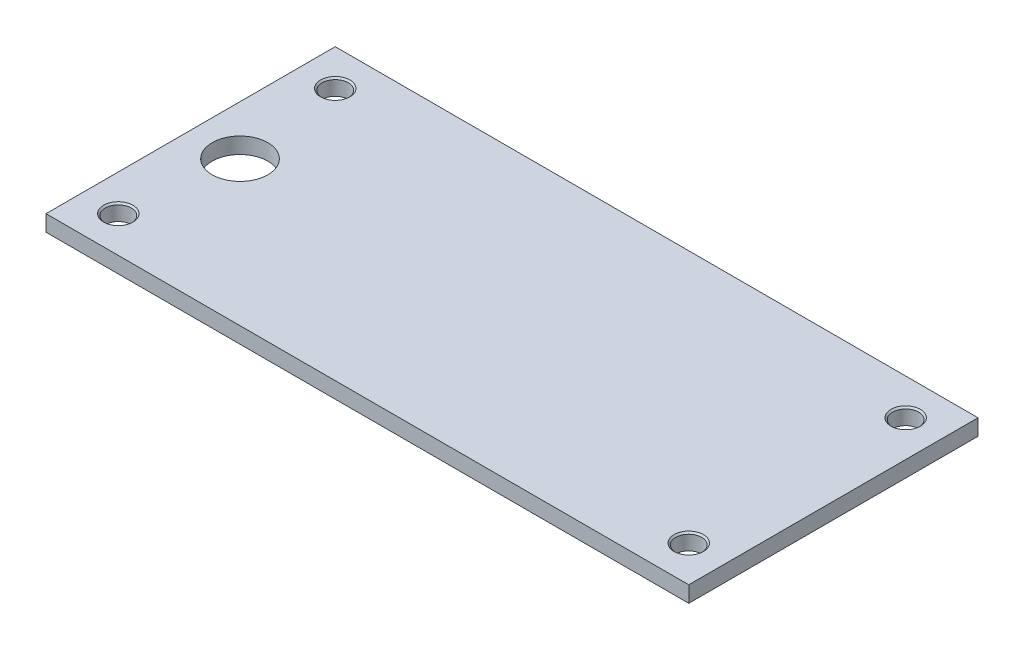
ISO-10303-21;
HEADER;
FILE_DESCRIPTION(('STEP AP214'),'2;1');
FILE_NAME('part.step','',(''),(''),'','','');
FILE_SCHEMA(('AUTOMOTIVE_DESIGN { 1 0 10303 214 1 1 1 1 }'));
ENDSEC;
DATA;
#1=APPLICATION_CONTEXT('core data for automotive mechanical design processes');
#2=APPLICATION_PROTOCOL_DEFINITION('international standard','automotive_design',2000,#1);
#3=PRODUCT_CONTEXT('',#1,'mechanical');
#4=PRODUCT('Part','Part','',(#3));
#5=PRODUCT_RELATED_PRODUCT_CATEGORY('part','',(#4));
#6=PRODUCT_DEFINITION_FORMATION('','',#4);
#7=PRODUCT_DEFINITION_CONTEXT('part definition',#1,'design');
#8=PRODUCT_DEFINITION('design','',#6,#7);
#9=PRODUCT_DEFINITION_SHAPE('','',#8);
#10=(LENGTH_UNIT() NAMED_UNIT(*) SI_UNIT(.MILLI.,.METRE.));
#11=(NAMED_UNIT(*) PLANE_ANGLE_UNIT() SI_UNIT($,.RADIAN.));
#12=(NAMED_UNIT(*) SI_UNIT($,.STERADIAN.) SOLID_ANGLE_UNIT());
#13=UNCERTAINTY_MEASURE_WITH_UNIT(LENGTH_MEASURE(1.E-05),#10,'distance_accuracy_value','');
#14=(GEOMETRIC_REPRESENTATION_CONTEXT(3) GLOBAL_UNCERTAINTY_ASSIGNED_CONTEXT((#13)) GLOBAL_UNIT_ASSIGNED_CONTEXT((#10,
#11,#12)) REPRESENTATION_CONTEXT('',''));
#15=CARTESIAN_POINT('',(0.,0.,0.));
#16=DIRECTION('',(0.,0.,1.));
#17=DIRECTION('',(1.,0.,0.));
#18=AXIS2_PLACEMENT_3D('',#15,#16,#17);
#19=CARTESIAN_POINT('',(127.,6.35,57.15));
#20=DIRECTION('',(-1.,0.,0.));
#21=DIRECTION('',(0.,0.,1.));
#22=AXIS2_PLACEMENT_3D('',#19,#20,#21);
#23=PLANE('',#22);
#24=DIRECTION('',(0.,0.,-1.));
#25=VECTOR('',#24,1.);
#26=CARTESIAN_POINT('',(127.,0.,57.15));
#27=LINE('',#26,#25);
#28=CARTESIAN_POINT('',(127.,0.,57.15));
#29=VERTEX_POINT('',#28);
#30=CARTESIAN_POINT('',(127.,0.,-57.15));
#31=VERTEX_POINT('',#30);
#32=EDGE_CURVE('E108',#29,#31,#27,.T.);
#33=ORIENTED_EDGE('',*,*,#32,.T.);
#34=DIRECTION('',(0.,-1.,0.));
#35=VECTOR('',#34,1.);
#36=CARTESIAN_POINT('',(127.,6.35,-57.15));
#37=LINE('',#36,#35);
#38=CARTESIAN_POINT('',(127.,6.35,-57.15));
#39=VERTEX_POINT('',#38);
#40=EDGE_CURVE('E11',#39,#31,#37,.T.);
#41=ORIENTED_EDGE('',*,*,#40,.F.);
#42=DIRECTION('',(0.,0.,-1.));
#43=VECTOR('',#42,1.);
#44=CARTESIAN_POINT('',(127.,6.35,57.15));
#45=LINE('',#44,#43);
#46=CARTESIAN_POINT('',(127.,6.35,57.15));
#47=VERTEX_POINT('',#46);
#48=EDGE_CURVE('E96',#47,#39,#45,.T.);
#49=ORIENTED_EDGE('',*,*,#48,.F.);
#50=DIRECTION('',(0.,-1.,0.));
#51=VECTOR('',#50,1.);
#52=CARTESIAN_POINT('',(127.,6.35,57.15));
#53=LINE('',#52,#51);
#54=EDGE_CURVE('E104',#47,#29,#53,.T.);
#55=ORIENTED_EDGE('',*,*,#54,.T.);
#56=EDGE_LOOP('',(#33,#41,#49,#55));
#57=FACE_BOUND('',#56,.T.);
#58=ADVANCED_FACE('F45',(#57),#23,.F.);
#59=CARTESIAN_POINT('',(-127.,6.35,-57.15));
#60=DIRECTION('',(0.,0.,1.));
#61=DIRECTION('',(1.,0.,0.));
#62=AXIS2_PLACEMENT_3D('',#59,#60,#61);
#63=PLANE('',#62);
#64=DIRECTION('',(-1.,0.,0.));
#65=VECTOR('',#64,1.);
#66=CARTESIAN_POINT('',(-127.,0.,-57.15));
#67=LINE('',#66,#65);
#68=CARTESIAN_POINT('',(-127.,0.,-57.15));
#69=VERTEX_POINT('',#68);
#70=EDGE_CURVE('E100',#31,#69,#67,.T.);
#71=ORIENTED_EDGE('',*,*,#70,.T.);
#72=DIRECTION('',(0.,-1.,0.));
#73=VECTOR('',#72,1.);
#74=CARTESIAN_POINT('',(-127.,6.35,-57.15));
#75=LINE('',#74,#73);
#76=CARTESIAN_POINT('',(-127.,6.35,-57.15));
#77=VERTEX_POINT('',#76);
#78=EDGE_CURVE('E53',#77,#69,#75,.T.);
#79=ORIENTED_EDGE('',*,*,#78,.F.);
#80=DIRECTION('',(-1.,0.,0.));
#81=VECTOR('',#80,1.);
#82=CARTESIAN_POINT('',(-127.,6.35,-57.15));
#83=LINE('',#82,#81);
#84=EDGE_CURVE('E91',#39,#77,#83,.T.);
#85=ORIENTED_EDGE('',*,*,#84,.F.);
#86=ORIENTED_EDGE('',*,*,#40,.T.);
#87=EDGE_LOOP('',(#71,#79,#85,#86));
#88=FACE_BOUND('',#87,.T.);
#89=ADVANCED_FACE('F99',(#88),#63,.F.);
#90=CARTESIAN_POINT('',(-127.,6.35,57.15));
#91=DIRECTION('',(1.,0.,0.));
#92=DIRECTION('',(0.,0.,-1.));
#93=AXIS2_PLACEMENT_3D('',#90,#91,#92);
#94=PLANE('',#93);
#95=DIRECTION('',(0.,0.,1.));
#96=VECTOR('',#95,1.);
#97=CARTESIAN_POINT('',(-127.,0.,57.15));
#98=LINE('',#97,#96);
#99=CARTESIAN_POINT('',(-127.,0.,57.15));
#100=VERTEX_POINT('',#99);
#101=EDGE_CURVE('E78',#69,#100,#98,.T.);
#102=ORIENTED_EDGE('',*,*,#101,.T.);
#103=DIRECTION('',(0.,-1.,0.));
#104=VECTOR('',#103,1.);
#105=CARTESIAN_POINT('',(-127.,6.35,57.15));
#106=LINE('',#105,#104);
#107=CARTESIAN_POINT('',(-127.,6.35,57.15));
#108=VERTEX_POINT('',#107);
#109=EDGE_CURVE('E101',#108,#100,#106,.T.);
#110=ORIENTED_EDGE('',*,*,#109,.F.);
#111=DIRECTION('',(0.,0.,1.));
#112=VECTOR('',#111,1.);
#113=CARTESIAN_POINT('',(-127.,6.35,57.15));
#114=LINE('',#113,#112);
#115=EDGE_CURVE('E94',#77,#108,#114,.T.);
#116=ORIENTED_EDGE('',*,*,#115,.F.);
#117=ORIENTED_EDGE('',*,*,#78,.T.);
#118=EDGE_LOOP('',(#102,#110,#116,#117));
#119=FACE_BOUND('',#118,.T.);
#120=ADVANCED_FACE('F102',(#119),#94,.F.);
#121=CARTESIAN_POINT('',(-127.,6.35,57.15));
#122=DIRECTION('',(0.,0.,-1.));
#123=DIRECTION('',(-1.,0.,0.));
#124=AXIS2_PLACEMENT_3D('',#121,#122,#123);
#125=PLANE('',#124);
#126=DIRECTION('',(1.,0.,0.));
#127=VECTOR('',#126,1.);
#128=CARTESIAN_POINT('',(-127.,0.,57.15));
#129=LINE('',#128,#127);
#130=EDGE_CURVE('E84',#100,#29,#129,.T.);
#131=ORIENTED_EDGE('',*,*,#130,.T.);
#132=ORIENTED_EDGE('',*,*,#54,.F.);
#133=DIRECTION('',(1.,0.,0.));
#134=VECTOR('',#133,1.);
#135=CARTESIAN_POINT('',(-127.,6.35,57.15));
#136=LINE('',#135,#134);
#137=EDGE_CURVE('E61',#108,#47,#136,.T.);
#138=ORIENTED_EDGE('',*,*,#137,.F.);
#139=ORIENTED_EDGE('',*,*,#109,.T.);
#140=EDGE_LOOP('',(#131,#132,#138,#139));
#141=FACE_BOUND('',#140,.T.);
#142=ADVANCED_FACE('F116',(#141),#125,.F.);
#143=CARTESIAN_POINT('',(0.,6.35,0.));
#144=DIRECTION('',(0.,-1.,0.));
#145=DIRECTION('',(0.,0.,-1.));
#146=AXIS2_PLACEMENT_3D('',#143,#144,#145);
#147=PLANE('',#146);
#148=CARTESIAN_POINT('',(112.7125,6.35,-42.862500000001));
#149=DIRECTION('',(0.,1.,0.));
#150=DIRECTION('',(0.,0.,1.));
#151=AXIS2_PLACEMENT_3D('',#148,#149,#150);
#152=CIRCLE('',#151,5.79374000000001);
#153=CARTESIAN_POINT('',(112.7125,6.35,-37.068760000001));
#154=VERTEX_POINT('',#153);
#155=EDGE_CURVE('E160',#154,#154,#152,.T.);
#156=ORIENTED_EDGE('',*,*,#155,.F.);
#157=EDGE_LOOP('',(#156));
#158=FACE_BOUND('',#157,.T.);
#159=CARTESIAN_POINT('',(112.7125,6.35,42.8674999999988));
#160=DIRECTION('',(0.,1.,0.));
#161=DIRECTION('',(0.,0.,1.));
#162=AXIS2_PLACEMENT_3D('',#159,#160,#161);
#163=CIRCLE('',#162,5.79374000000001);
#164=CARTESIAN_POINT('',(112.7125,6.35,48.6612399999988));
#165=VERTEX_POINT('',#164);
#166=EDGE_CURVE('E151',#165,#165,#163,.T.);
#167=ORIENTED_EDGE('',*,*,#166,.F.);
#168=EDGE_LOOP('',(#167));
#169=FACE_BOUND('',#168,.T.);
#170=CARTESIAN_POINT('',(-112.7175,6.35,42.867499999999));
#171=DIRECTION('',(0.,1.,0.));
#172=DIRECTION('',(0.,0.,1.));
#173=AXIS2_PLACEMENT_3D('',#170,#171,#172);
#174=CIRCLE('',#173,5.79373999999999);
#175=CARTESIAN_POINT('',(-112.7175,6.35,48.661239999999));
#176=VERTEX_POINT('',#175);
#177=EDGE_CURVE('E142',#176,#176,#174,.T.);
#178=ORIENTED_EDGE('',*,*,#177,.F.);
#179=EDGE_LOOP('',(#178));
#180=FACE_BOUND('',#179,.T.);
#181=CARTESIAN_POINT('',(-112.717499999998,6.35,-42.8625000000029));
#182=DIRECTION('',(0.,1.,0.));
#183=DIRECTION('',(0.,0.,1.));
#184=AXIS2_PLACEMENT_3D('',#181,#182,#183);
#185=CIRCLE('',#184,5.79373999999999);
#186=CARTESIAN_POINT('',(-112.717499999998,6.35,-37.0687600000029));
#187=VERTEX_POINT('',#186);
#188=EDGE_CURVE('E133',#187,#187,#185,.T.);
#189=ORIENTED_EDGE('',*,*,#188,.F.);
#190=EDGE_LOOP('',(#189));
#191=FACE_BOUND('',#190,.T.);
#192=CARTESIAN_POINT('',(-107.475,6.35,0.));
#193=DIRECTION('',(0.,1.,0.));
#194=DIRECTION('',(0.,0.,1.));
#195=AXIS2_PLACEMENT_3D('',#192,#193,#194);
#196=CIRCLE('',#195,11.);
#197=CARTESIAN_POINT('',(-107.475,6.35,11.));
#198=VERTEX_POINT('',#197);
#199=EDGE_CURVE('E122',#198,#198,#196,.T.);
#200=ORIENTED_EDGE('',*,*,#199,.F.);
#201=EDGE_LOOP('',(#200));
#202=FACE_BOUND('',#201,.T.);
#203=ORIENTED_EDGE('',*,*,#48,.T.);
#204=ORIENTED_EDGE('',*,*,#84,.T.);
#205=ORIENTED_EDGE('',*,*,#115,.T.);
#206=ORIENTED_EDGE('',*,*,#137,.T.);
#207=EDGE_LOOP('',(#203,#204,#205,#206));
#208=FACE_BOUND('',#207,.T.);
#209=ADVANCED_FACE('F92',(#158,#169,#180,#191,#202,#208),#147,.F.);
#210=CARTESIAN_POINT('',(0.,0.,0.));
#211=DIRECTION('',(0.,-1.,0.));
#212=DIRECTION('',(0.,0.,-1.));
#213=AXIS2_PLACEMENT_3D('',#210,#211,#212);
#214=PLANE('',#213);
#215=CARTESIAN_POINT('',(112.7125,0.,-42.862500000001));
#216=DIRECTION('',(0.,1.,0.));
#217=DIRECTION('',(0.,0.,1.));
#218=AXIS2_PLACEMENT_3D('',#215,#216,#217);
#219=CIRCLE('',#218,5.15873999999998);
#220=CARTESIAN_POINT('',(112.7125,0.,-37.703760000001));
#221=VERTEX_POINT('',#220);
#222=EDGE_CURVE('E154',#221,#221,#219,.T.);
#223=ORIENTED_EDGE('',*,*,#222,.T.);
#224=EDGE_LOOP('',(#223));
#225=FACE_BOUND('',#224,.T.);
#226=CARTESIAN_POINT('',(112.7125,0.,42.8674999999988));
#227=DIRECTION('',(0.,1.,0.));
#228=DIRECTION('',(0.,0.,1.));
#229=AXIS2_PLACEMENT_3D('',#226,#227,#228);
#230=CIRCLE('',#229,5.15873999999998);
#231=CARTESIAN_POINT('',(112.7125,0.,48.0262399999988));
#232=VERTEX_POINT('',#231);
#233=EDGE_CURVE('E145',#232,#232,#230,.T.);
#234=ORIENTED_EDGE('',*,*,#233,.T.);
#235=EDGE_LOOP('',(#234));
#236=FACE_BOUND('',#235,.T.);
#237=CARTESIAN_POINT('',(-112.7175,0.,42.867499999999));
#238=DIRECTION('',(0.,1.,0.));
#239=DIRECTION('',(0.,0.,1.));
#240=AXIS2_PLACEMENT_3D('',#237,#238,#239);
#241=CIRCLE('',#240,5.15873999999998);
#242=CARTESIAN_POINT('',(-112.7175,0.,48.026239999999));
#243=VERTEX_POINT('',#242);
#244=EDGE_CURVE('E136',#243,#243,#241,.T.);
#245=ORIENTED_EDGE('',*,*,#244,.T.);
#246=EDGE_LOOP('',(#245));
#247=FACE_BOUND('',#246,.T.);
#248=CARTESIAN_POINT('',(-112.717499999998,0.,-42.8625000000029));
#249=DIRECTION('',(0.,1.,0.));
#250=DIRECTION('',(0.,0.,1.));
#251=AXIS2_PLACEMENT_3D('',#248,#249,#250);
#252=CIRCLE('',#251,5.15873999999998);
#253=CARTESIAN_POINT('',(-112.717499999998,0.,-37.703760000003));
#254=VERTEX_POINT('',#253);
#255=EDGE_CURVE('E125',#254,#254,#252,.T.);
#256=ORIENTED_EDGE('',*,*,#255,.T.);
#257=EDGE_LOOP('',(#256));
#258=FACE_BOUND('',#257,.T.);
#259=CARTESIAN_POINT('',(-107.475,0.,0.));
#260=DIRECTION('',(0.,1.,0.));
#261=DIRECTION('',(0.,0.,1.));
#262=AXIS2_PLACEMENT_3D('',#259,#260,#261);
#263=CIRCLE('',#262,11.);
#264=CARTESIAN_POINT('',(-107.475,0.,11.));
#265=VERTEX_POINT('',#264);
#266=EDGE_CURVE('E111',#265,#265,#263,.T.);
#267=ORIENTED_EDGE('',*,*,#266,.T.);
#268=EDGE_LOOP('',(#267));
#269=FACE_BOUND('',#268,.T.);
#270=ORIENTED_EDGE('',*,*,#32,.F.);
#271=ORIENTED_EDGE('',*,*,#130,.F.);
#272=ORIENTED_EDGE('',*,*,#101,.F.);
#273=ORIENTED_EDGE('',*,*,#70,.F.);
#274=EDGE_LOOP('',(#270,#271,#272,#273));
#275=FACE_BOUND('',#274,.T.);
#276=ADVANCED_FACE('F119',(#225,#236,#247,#258,#269,#275),#214,.T.);
#277=CARTESIAN_POINT('',(-107.475,0.,0.));
#278=DIRECTION('',(0.,1.,0.));
#279=DIRECTION('',(0.,0.,1.));
#280=AXIS2_PLACEMENT_3D('',#277,#278,#279);
#281=CYLINDRICAL_SURFACE('',#280,11.);
#282=ORIENTED_EDGE('',*,*,#266,.F.);
#283=EDGE_LOOP('',(#282));
#284=FACE_BOUND('',#283,.T.);
#285=ORIENTED_EDGE('',*,*,#199,.T.);
#286=EDGE_LOOP('',(#285));
#287=FACE_BOUND('',#286,.T.);
#288=ADVANCED_FACE('F177',(#284,#287),#281,.F.);
#289=CARTESIAN_POINT('',(-112.717499999998,6.35,-42.8625000000029));
#290=DIRECTION('',(0.,1.,0.));
#291=DIRECTION('',(0.,0.,1.));
#292=AXIS2_PLACEMENT_3D('',#289,#290,#291);
#293=CYLINDRICAL_SURFACE('',#292,5.15873999999999);
#294=ORIENTED_EDGE('',*,*,#255,.F.);
#295=EDGE_LOOP('',(#294));
#296=FACE_BOUND('',#295,.T.);
#297=CARTESIAN_POINT('',(-112.717499999998,5.715,-42.8625000000029));
#298=DIRECTION('',(0.,1.,0.));
#299=DIRECTION('',(0.,0.,1.));
#300=AXIS2_PLACEMENT_3D('',#297,#298,#299);
#301=CIRCLE('',#300,5.15873999999999);
#302=CARTESIAN_POINT('',(-112.717499999998,5.715,-37.7037600000029));
#303=VERTEX_POINT('',#302);
#304=EDGE_CURVE('E130',#303,#303,#301,.T.);
#305=ORIENTED_EDGE('',*,*,#304,.T.);
#306=EDGE_LOOP('',(#305));
#307=FACE_BOUND('',#306,.T.);
#308=ADVANCED_FACE('F179',(#296,#307),#293,.F.);
#309=CARTESIAN_POINT('',(-112.717499999998,6.35,-42.8625000000029));
#310=DIRECTION('',(0.,1.,0.));
#311=DIRECTION('',(0.,0.,1.));
#312=AXIS2_PLACEMENT_3D('',#309,#310,#311);
#313=CONICAL_SURFACE('',#312,5.79373999999999,0.785398163397444);
#314=ORIENTED_EDGE('',*,*,#304,.F.);
#315=EDGE_LOOP('',(#314));
#316=FACE_BOUND('',#315,.T.);
#317=ORIENTED_EDGE('',*,*,#188,.T.);
#318=EDGE_LOOP('',(#317));
#319=FACE_BOUND('',#318,.T.);
#320=ADVANCED_FACE('F186',(#316,#319),#313,.F.);
#321=CARTESIAN_POINT('',(-112.7175,6.35,42.867499999999));
#322=DIRECTION('',(0.,1.,0.));
#323=DIRECTION('',(0.,0.,1.));
#324=AXIS2_PLACEMENT_3D('',#321,#322,#323);
#325=CYLINDRICAL_SURFACE('',#324,5.15873999999999);
#326=ORIENTED_EDGE('',*,*,#244,.F.);
#327=EDGE_LOOP('',(#326));
#328=FACE_BOUND('',#327,.T.);
#329=CARTESIAN_POINT('',(-112.7175,5.715,42.867499999999));
#330=DIRECTION('',(0.,1.,0.));
#331=DIRECTION('',(0.,0.,1.));
#332=AXIS2_PLACEMENT_3D('',#329,#330,#331);
#333=CIRCLE('',#332,5.15873999999999);
#334=CARTESIAN_POINT('',(-112.7175,5.715,48.026239999999));
#335=VERTEX_POINT('',#334);
#336=EDGE_CURVE('E139',#335,#335,#333,.T.);
#337=ORIENTED_EDGE('',*,*,#336,.T.);
#338=EDGE_LOOP('',(#337));
#339=FACE_BOUND('',#338,.T.);
#340=ADVANCED_FACE('F246',(#328,#339),#325,.F.);
#341=CARTESIAN_POINT('',(-112.7175,6.35,42.867499999999));
#342=DIRECTION('',(0.,1.,0.));
#343=DIRECTION('',(0.,0.,1.));
#344=AXIS2_PLACEMENT_3D('',#341,#342,#343);
#345=CONICAL_SURFACE('',#344,5.79373999999999,0.785398163397444);
#346=ORIENTED_EDGE('',*,*,#336,.F.);
#347=EDGE_LOOP('',(#346));
#348=FACE_BOUND('',#347,.T.);
#349=ORIENTED_EDGE('',*,*,#177,.T.);
#350=EDGE_LOOP('',(#349));
#351=FACE_BOUND('',#350,.T.);
#352=ADVANCED_FACE('F255',(#348,#351),#345,.F.);
#353=CARTESIAN_POINT('',(112.7125,6.35,42.8674999999988));
#354=DIRECTION('',(0.,1.,0.));
#355=DIRECTION('',(0.,0.,1.));
#356=AXIS2_PLACEMENT_3D('',#353,#354,#355);
#357=CYLINDRICAL_SURFACE('',#356,5.15873999999999);
#358=ORIENTED_EDGE('',*,*,#233,.F.);
#359=EDGE_LOOP('',(#358));
#360=FACE_BOUND('',#359,.T.);
#361=CARTESIAN_POINT('',(112.7125,5.715,42.8674999999988));
#362=DIRECTION('',(0.,1.,0.));
#363=DIRECTION('',(0.,0.,1.));
#364=AXIS2_PLACEMENT_3D('',#361,#362,#363);
#365=CIRCLE('',#364,5.15873999999999);
#366=CARTESIAN_POINT('',(112.7125,5.715,48.0262399999988));
#367=VERTEX_POINT('',#366);
#368=EDGE_CURVE('E148',#367,#367,#365,.T.);
#369=ORIENTED_EDGE('',*,*,#368,.T.);
#370=EDGE_LOOP('',(#369));
#371=FACE_BOUND('',#370,.T.);
#372=ADVANCED_FACE('F264',(#360,#371),#357,.F.);
#373=CARTESIAN_POINT('',(112.7125,6.35,42.8674999999988));
#374=DIRECTION('',(0.,1.,0.));
#375=DIRECTION('',(0.,0.,1.));
#376=AXIS2_PLACEMENT_3D('',#373,#374,#375);
#377=CONICAL_SURFACE('',#376,5.79374000000001,0.785398163397455);
#378=ORIENTED_EDGE('',*,*,#368,.F.);
#379=EDGE_LOOP('',(#378));
#380=FACE_BOUND('',#379,.T.);
#381=ORIENTED_EDGE('',*,*,#166,.T.);
#382=EDGE_LOOP('',(#381));
#383=FACE_BOUND('',#382,.T.);
#384=ADVANCED_FACE('F273',(#380,#383),#377,.F.);
#385=CARTESIAN_POINT('',(112.7125,6.35,-42.862500000001));
#386=DIRECTION('',(0.,1.,0.));
#387=DIRECTION('',(0.,0.,1.));
#388=AXIS2_PLACEMENT_3D('',#385,#386,#387);
#389=CYLINDRICAL_SURFACE('',#388,5.15873999999999);
#390=ORIENTED_EDGE('',*,*,#222,.F.);
#391=EDGE_LOOP('',(#390));
#392=FACE_BOUND('',#391,.T.);
#393=CARTESIAN_POINT('',(112.7125,5.715,-42.862500000001));
#394=DIRECTION('',(0.,1.,0.));
#395=DIRECTION('',(0.,0.,1.));
#396=AXIS2_PLACEMENT_3D('',#393,#394,#395);
#397=CIRCLE('',#396,5.15873999999999);
#398=CARTESIAN_POINT('',(112.7125,5.715,-37.703760000001));
#399=VERTEX_POINT('',#398);
#400=EDGE_CURVE('E157',#399,#399,#397,.T.);
#401=ORIENTED_EDGE('',*,*,#400,.T.);
#402=EDGE_LOOP('',(#401));
#403=FACE_BOUND('',#402,.T.);
#404=ADVANCED_FACE('F282',(#392,#403),#389,.F.);
#405=CARTESIAN_POINT('',(112.7125,6.35,-42.862500000001));
#406=DIRECTION('',(0.,1.,0.));
#407=DIRECTION('',(0.,0.,1.));
#408=AXIS2_PLACEMENT_3D('',#405,#406,#407);
#409=CONICAL_SURFACE('',#408,5.79374000000001,0.785398163397455);
#410=ORIENTED_EDGE('',*,*,#400,.F.);
#411=EDGE_LOOP('',(#410));
#412=FACE_BOUND('',#411,.T.);
#413=ORIENTED_EDGE('',*,*,#155,.T.);
#414=EDGE_LOOP('',(#413));
#415=FACE_BOUND('',#414,.T.);
#416=ADVANCED_FACE('F164',(#412,#415),#409,.F.);
#417=CLOSED_SHELL('',(#58,#89,#120,#142,#209,#276,#288,#308,#320,#340,#352,#372,#384,#404,#416));
#418=MANIFOLD_SOLID_BREP('B2',#417);
#419=ADVANCED_BREP_SHAPE_REPRESENTATION('',(#18,#418),#14);
#420=SHAPE_DEFINITION_REPRESENTATION(#9,#419);
ENDSEC;
END-ISO-10303-21;
